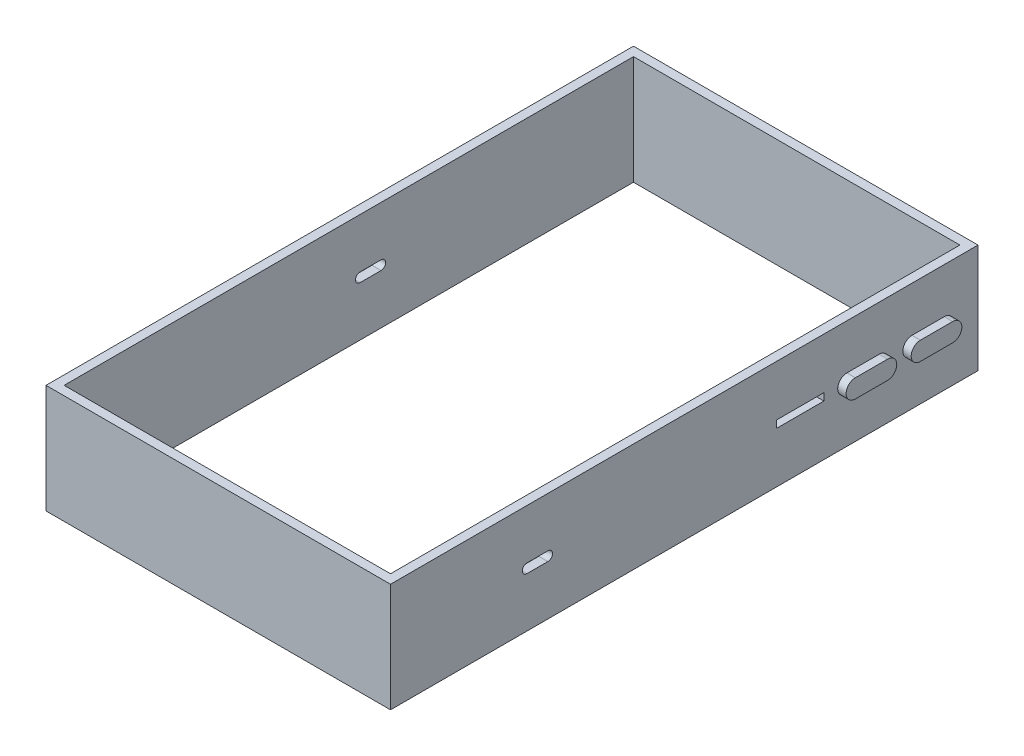
ISO-10303-21;
HEADER;
FILE_DESCRIPTION(('STEP AP214'),'2;1');
FILE_NAME('part.step','',(''),(''),'','','');
FILE_SCHEMA(('AUTOMOTIVE_DESIGN { 1 0 10303 214 1 1 1 1 }'));
ENDSEC;
DATA;
#1=APPLICATION_CONTEXT('core data for automotive mechanical design processes');
#2=APPLICATION_PROTOCOL_DEFINITION('international standard','automotive_design',2000,#1);
#3=PRODUCT_CONTEXT('',#1,'mechanical');
#4=PRODUCT('Part','Part','',(#3));
#5=PRODUCT_RELATED_PRODUCT_CATEGORY('part','',(#4));
#6=PRODUCT_DEFINITION_FORMATION('','',#4);
#7=PRODUCT_DEFINITION_CONTEXT('part definition',#1,'design');
#8=PRODUCT_DEFINITION('design','',#6,#7);
#9=PRODUCT_DEFINITION_SHAPE('','',#8);
#10=(LENGTH_UNIT() NAMED_UNIT(*) SI_UNIT(.MILLI.,.METRE.));
#11=(NAMED_UNIT(*) PLANE_ANGLE_UNIT() SI_UNIT($,.RADIAN.));
#12=(NAMED_UNIT(*) SI_UNIT($,.STERADIAN.) SOLID_ANGLE_UNIT());
#13=UNCERTAINTY_MEASURE_WITH_UNIT(LENGTH_MEASURE(1.E-05),#10,'distance_accuracy_value','');
#14=(GEOMETRIC_REPRESENTATION_CONTEXT(3) GLOBAL_UNCERTAINTY_ASSIGNED_CONTEXT((#13)) GLOBAL_UNIT_ASSIGNED_CONTEXT((#10,
#11,#12)) REPRESENTATION_CONTEXT('',''));
#15=CARTESIAN_POINT('',(0.,0.,0.));
#16=DIRECTION('',(0.,0.,1.));
#17=DIRECTION('',(1.,0.,0.));
#18=AXIS2_PLACEMENT_3D('',#15,#16,#17);
#19=CARTESIAN_POINT('',(-47.499999996,30.,81.000000052));
#20=DIRECTION('',(1.,0.,0.));
#21=DIRECTION('',(0.,0.,-1.));
#22=AXIS2_PLACEMENT_3D('',#19,#20,#21);
#23=PLANE('',#22);
#24=DIRECTION('',(0.,0.,1.));
#25=VECTOR('',#24,1.);
#26=CARTESIAN_POINT('',(-47.499999996,0.,81.000000052));
#27=LINE('',#26,#25);
#28=CARTESIAN_POINT('',(-47.499999996,0.,-81.000000052));
#29=VERTEX_POINT('',#28);
#30=CARTESIAN_POINT('',(-47.499999996,0.,81.000000052));
#31=VERTEX_POINT('',#30);
#32=EDGE_CURVE('E525',#29,#31,#27,.T.);
#33=ORIENTED_EDGE('',*,*,#32,.T.);
#34=DIRECTION('',(0.,-1.,0.));
#35=VECTOR('',#34,1.);
#36=CARTESIAN_POINT('',(-47.499999996,30.,81.000000052));
#37=LINE('',#36,#35);
#38=CARTESIAN_POINT('',(-47.499999996,30.,81.000000052));
#39=VERTEX_POINT('',#38);
#40=EDGE_CURVE('E572',#39,#31,#37,.T.);
#41=ORIENTED_EDGE('',*,*,#40,.F.);
#42=DIRECTION('',(0.,0.,1.));
#43=VECTOR('',#42,1.);
#44=CARTESIAN_POINT('',(-47.499999996,30.,81.000000052));
#45=LINE('',#44,#43);
#46=CARTESIAN_POINT('',(-47.499999996,30.,-81.000000052));
#47=VERTEX_POINT('',#46);
#48=EDGE_CURVE('E535',#47,#39,#45,.T.);
#49=ORIENTED_EDGE('',*,*,#48,.F.);
#50=DIRECTION('',(0.,-1.,0.));
#51=VECTOR('',#50,1.);
#52=CARTESIAN_POINT('',(-47.499999996,30.,-81.000000052));
#53=LINE('',#52,#51);
#54=EDGE_CURVE('E549',#47,#29,#53,.T.);
#55=ORIENTED_EDGE('',*,*,#54,.T.);
#56=EDGE_LOOP('',(#33,#41,#49,#55));
#57=FACE_BOUND('',#56,.T.);
#58=DIRECTION('',(0.,0.,1.));
#59=VECTOR('',#58,1.);
#60=CARTESIAN_POINT('',(-47.499999996,13.72,-8.89000009400002));
#61=LINE('',#60,#59);
#62=CARTESIAN_POINT('',(-47.499999996,13.72,-8.89000009400001));
#63=VERTEX_POINT('',#62);
#64=CARTESIAN_POINT('',(-47.499999996,13.72,-3.11000001000002));
#65=VERTEX_POINT('',#64);
#66=EDGE_CURVE('E282',#63,#65,#61,.T.);
#67=ORIENTED_EDGE('',*,*,#66,.F.);
#68=CARTESIAN_POINT('',(-47.499999996,15.,-8.89000009400002));
#69=DIRECTION('',(-1.,0.,0.));
#70=DIRECTION('',(0.,0.,1.));
#71=AXIS2_PLACEMENT_3D('',#68,#69,#70);
#72=CIRCLE('',#71,1.28);
#73=CARTESIAN_POINT('',(-47.499999996,16.28,-8.89000009400002));
#74=VERTEX_POINT('',#73);
#75=EDGE_CURVE('E278',#74,#63,#72,.T.);
#76=ORIENTED_EDGE('',*,*,#75,.F.);
#77=DIRECTION('',(0.,0.,-1.));
#78=VECTOR('',#77,1.);
#79=CARTESIAN_POINT('',(-47.499999996,16.28,-8.89000009400002));
#80=LINE('',#79,#78);
#81=CARTESIAN_POINT('',(-47.499999996,16.28,-3.11000001000002));
#82=VERTEX_POINT('',#81);
#83=EDGE_CURVE('E295',#82,#74,#80,.T.);
#84=ORIENTED_EDGE('',*,*,#83,.F.);
#85=CARTESIAN_POINT('',(-47.499999996,15.,-3.11000001000002));
#86=DIRECTION('',(-1.,0.,0.));
#87=DIRECTION('',(0.,0.,1.));
#88=AXIS2_PLACEMENT_3D('',#85,#86,#87);
#89=CIRCLE('',#88,1.28);
#90=EDGE_CURVE('E291',#65,#82,#89,.T.);
#91=ORIENTED_EDGE('',*,*,#90,.F.);
#92=EDGE_LOOP('',(#67,#76,#84,#91));
#93=FACE_BOUND('',#92,.T.);
#94=CARTESIAN_POINT('',(-47.499999996,12.2576364727922,-59.880000052));
#95=DIRECTION('',(-1.,0.,0.));
#96=DIRECTION('',(0.,0.,1.));
#97=AXIS2_PLACEMENT_3D('',#94,#95,#96);
#98=CIRCLE('',#97,2.54);
#99=CARTESIAN_POINT('',(-47.499999996,9.71763647279217,-59.880000052));
#100=VERTEX_POINT('',#99);
#101=CARTESIAN_POINT('',(-47.499999996,14.7976364727922,-59.880000052));
#102=VERTEX_POINT('',#101);
#103=EDGE_CURVE('E276',#100,#102,#98,.T.);
#104=ORIENTED_EDGE('',*,*,#103,.F.);
#105=DIRECTION('',(0.,0.,1.));
#106=VECTOR('',#105,1.);
#107=CARTESIAN_POINT('',(-47.499999996,9.71763647279217,-59.880000052));
#108=LINE('',#107,#106);
#109=CARTESIAN_POINT('',(-47.499999996,9.71763647279217,-67.500000052));
#110=VERTEX_POINT('',#109);
#111=EDGE_CURVE('E273',#110,#100,#108,.T.);
#112=ORIENTED_EDGE('',*,*,#111,.F.);
#113=CARTESIAN_POINT('',(-47.499999996,12.2576364727922,-67.500000052));
#114=DIRECTION('',(-1.,0.,0.));
#115=DIRECTION('',(0.,0.,1.));
#116=AXIS2_PLACEMENT_3D('',#113,#114,#115);
#117=CIRCLE('',#116,2.54);
#118=CARTESIAN_POINT('',(-47.499999996,14.7976364727922,-67.500000052));
#119=VERTEX_POINT('',#118);
#120=EDGE_CURVE('E65',#119,#110,#117,.T.);
#121=ORIENTED_EDGE('',*,*,#120,.F.);
#122=DIRECTION('',(0.,0.,-1.));
#123=VECTOR('',#122,1.);
#124=CARTESIAN_POINT('',(-47.499999996,14.7976364727922,-59.880000052));
#125=LINE('',#124,#123);
#126=EDGE_CURVE('E60',#102,#119,#125,.T.);
#127=ORIENTED_EDGE('',*,*,#126,.F.);
#128=EDGE_LOOP('',(#104,#112,#121,#127));
#129=FACE_BOUND('',#128,.T.);
#130=ADVANCED_FACE('F45',(#57,#93,#129),#23,.F.);
#131=CARTESIAN_POINT('',(47.499999996,30.,81.000000052));
#132=DIRECTION('',(-1.,0.,0.));
#133=DIRECTION('',(0.,0.,1.));
#134=AXIS2_PLACEMENT_3D('',#131,#132,#133);
#135=PLANE('',#134);
#136=CARTESIAN_POINT('',(47.499999996,15.,-53.744999952));
#137=DIRECTION('',(1.,0.,0.));
#138=DIRECTION('',(0.,0.,-1.));
#139=AXIS2_PLACEMENT_3D('',#136,#137,#138);
#140=CIRCLE('',#139,2.54);
#141=CARTESIAN_POINT('',(47.499999996,12.46,-53.744999952));
#142=VERTEX_POINT('',#141);
#143=CARTESIAN_POINT('',(47.499999996,17.54,-53.744999952));
#144=VERTEX_POINT('',#143);
#145=EDGE_CURVE('E395',#142,#144,#140,.T.);
#146=ORIENTED_EDGE('',*,*,#145,.F.);
#147=DIRECTION('',(0.,0.,-1.));
#148=VECTOR('',#147,1.);
#149=CARTESIAN_POINT('',(47.499999996,12.46,-53.744999952));
#150=LINE('',#149,#148);
#151=CARTESIAN_POINT('',(47.499999996,12.46,-44.854999952));
#152=VERTEX_POINT('',#151);
#153=EDGE_CURVE('E440',#152,#142,#150,.T.);
#154=ORIENTED_EDGE('',*,*,#153,.F.);
#155=CARTESIAN_POINT('',(47.499999996,15.,-44.854999952));
#156=DIRECTION('',(1.,0.,0.));
#157=DIRECTION('',(0.,0.,-1.));
#158=AXIS2_PLACEMENT_3D('',#155,#156,#157);
#159=CIRCLE('',#158,2.54);
#160=CARTESIAN_POINT('',(47.499999996,17.54,-44.854999952));
#161=VERTEX_POINT('',#160);
#162=EDGE_CURVE('E444',#161,#152,#159,.T.);
#163=ORIENTED_EDGE('',*,*,#162,.F.);
#164=DIRECTION('',(0.,0.,1.));
#165=VECTOR('',#164,1.);
#166=CARTESIAN_POINT('',(47.499999996,17.54,-53.744999952));
#167=LINE('',#166,#165);
#168=EDGE_CURVE('E449',#144,#161,#167,.T.);
#169=ORIENTED_EDGE('',*,*,#168,.F.);
#170=EDGE_LOOP('',(#146,#154,#163,#169));
#171=FACE_BOUND('',#170,.T.);
#172=CARTESIAN_POINT('',(47.499999996,15.,37.609999928));
#173=DIRECTION('',(1.,0.,0.));
#174=DIRECTION('',(0.,0.,-1.));
#175=AXIS2_PLACEMENT_3D('',#172,#173,#174);
#176=CIRCLE('',#175,1.27999998);
#177=CARTESIAN_POINT('',(47.499999996,13.72000002,37.609999928));
#178=VERTEX_POINT('',#177);
#179=CARTESIAN_POINT('',(47.499999996,16.27999998,37.609999928));
#180=VERTEX_POINT('',#179);
#181=EDGE_CURVE('E471',#178,#180,#176,.T.);
#182=ORIENTED_EDGE('',*,*,#181,.F.);
#183=DIRECTION('',(0.,0.,-1.));
#184=VECTOR('',#183,1.);
#185=CARTESIAN_POINT('',(47.499999996,13.72000002,37.609999928));
#186=LINE('',#185,#184);
#187=CARTESIAN_POINT('',(47.499999996,13.72000002,43.389999968));
#188=VERTEX_POINT('',#187);
#189=EDGE_CURVE('E374',#188,#178,#186,.T.);
#190=ORIENTED_EDGE('',*,*,#189,.F.);
#191=CARTESIAN_POINT('',(47.499999996,15.,43.389999968));
#192=DIRECTION('',(1.,0.,0.));
#193=DIRECTION('',(0.,0.,-1.));
#194=AXIS2_PLACEMENT_3D('',#191,#192,#193);
#195=CIRCLE('',#194,1.27999998);
#196=CARTESIAN_POINT('',(47.499999996,16.27999998,43.389999968));
#197=VERTEX_POINT('',#196);
#198=EDGE_CURVE('E482',#197,#188,#195,.T.);
#199=ORIENTED_EDGE('',*,*,#198,.F.);
#200=DIRECTION('',(0.,0.,1.));
#201=VECTOR('',#200,1.);
#202=CARTESIAN_POINT('',(47.499999996,16.27999998,37.609999928));
#203=LINE('',#202,#201);
#204=EDGE_CURVE('E485',#180,#197,#203,.T.);
#205=ORIENTED_EDGE('',*,*,#204,.F.);
#206=EDGE_LOOP('',(#182,#190,#199,#205));
#207=FACE_BOUND('',#206,.T.);
#208=DIRECTION('',(0.,0.,-1.));
#209=VECTOR('',#208,1.);
#210=CARTESIAN_POINT('',(47.499999996,0.,81.000000052));
#211=LINE('',#210,#209);
#212=CARTESIAN_POINT('',(47.499999996,0.,81.000000052));
#213=VERTEX_POINT('',#212);
#214=CARTESIAN_POINT('',(47.499999996,0.,-81.000000052));
#215=VERTEX_POINT('',#214);
#216=EDGE_CURVE('E556',#213,#215,#211,.T.);
#217=ORIENTED_EDGE('',*,*,#216,.T.);
#218=DIRECTION('',(0.,-1.,0.));
#219=VECTOR('',#218,1.);
#220=CARTESIAN_POINT('',(47.499999996,30.,-81.000000052));
#221=LINE('',#220,#219);
#222=CARTESIAN_POINT('',(47.499999996,30.,-81.000000052));
#223=VERTEX_POINT('',#222);
#224=EDGE_CURVE('E564',#223,#215,#221,.T.);
#225=ORIENTED_EDGE('',*,*,#224,.F.);
#226=DIRECTION('',(0.,0.,-1.));
#227=VECTOR('',#226,1.);
#228=CARTESIAN_POINT('',(47.499999996,30.,81.000000052));
#229=LINE('',#228,#227);
#230=CARTESIAN_POINT('',(47.499999996,30.,81.000000052));
#231=VERTEX_POINT('',#230);
#232=EDGE_CURVE('E543',#231,#223,#229,.T.);
#233=ORIENTED_EDGE('',*,*,#232,.F.);
#234=DIRECTION('',(0.,-1.,0.));
#235=VECTOR('',#234,1.);
#236=CARTESIAN_POINT('',(47.499999996,30.,81.000000052));
#237=LINE('',#236,#235);
#238=EDGE_CURVE('E568',#231,#213,#237,.T.);
#239=ORIENTED_EDGE('',*,*,#238,.T.);
#240=EDGE_LOOP('',(#217,#225,#233,#239));
#241=FACE_BOUND('',#240,.T.);
#242=DIRECTION('',(0.,-1.,0.));
#243=VECTOR('',#242,1.);
#244=CARTESIAN_POINT('',(47.499999996,14.,-25.500000052));
#245=LINE('',#244,#243);
#246=CARTESIAN_POINT('',(47.499999996,16.,-25.500000052));
#247=VERTEX_POINT('',#246);
#248=CARTESIAN_POINT('',(47.499999996,14.,-25.500000052));
#249=VERTEX_POINT('',#248);
#250=EDGE_CURVE('E427',#247,#249,#245,.T.);
#251=ORIENTED_EDGE('',*,*,#250,.F.);
#252=DIRECTION('',(0.,0.,1.));
#253=VECTOR('',#252,1.);
#254=CARTESIAN_POINT('',(47.499999996,16.,-38.500000052));
#255=LINE('',#254,#253);
#256=CARTESIAN_POINT('',(47.499999996,16.,-38.500000052));
#257=VERTEX_POINT('',#256);
#258=EDGE_CURVE('E467',#257,#247,#255,.T.);
#259=ORIENTED_EDGE('',*,*,#258,.F.);
#260=DIRECTION('',(0.,1.,0.));
#261=VECTOR('',#260,1.);
#262=CARTESIAN_POINT('',(47.499999996,14.,-38.500000052));
#263=LINE('',#262,#261);
#264=CARTESIAN_POINT('',(47.499999996,14.,-38.500000052));
#265=VERTEX_POINT('',#264);
#266=EDGE_CURVE('E470',#265,#257,#263,.T.);
#267=ORIENTED_EDGE('',*,*,#266,.F.);
#268=DIRECTION('',(0.,0.,-1.));
#269=VECTOR('',#268,1.);
#270=CARTESIAN_POINT('',(47.499999996,14.,-38.500000052));
#271=LINE('',#270,#269);
#272=EDGE_CURVE('E474',#249,#265,#271,.T.);
#273=ORIENTED_EDGE('',*,*,#272,.F.);
#274=EDGE_LOOP('',(#251,#259,#267,#273));
#275=FACE_BOUND('',#274,.T.);
#276=CARTESIAN_POINT('',(47.499999996,15.,-71.695000052));
#277=DIRECTION('',(1.,0.,0.));
#278=DIRECTION('',(0.,0.,-1.));
#279=AXIS2_PLACEMENT_3D('',#276,#277,#278);
#280=CIRCLE('',#279,2.54);
#281=CARTESIAN_POINT('',(47.499999996,12.46,-71.695000052));
#282=VERTEX_POINT('',#281);
#283=CARTESIAN_POINT('',(47.499999996,17.54,-71.695000052));
#284=VERTEX_POINT('',#283);
#285=EDGE_CURVE('E390',#282,#284,#280,.T.);
#286=ORIENTED_EDGE('',*,*,#285,.F.);
#287=DIRECTION('',(0.,0.,-1.));
#288=VECTOR('',#287,1.);
#289=CARTESIAN_POINT('',(47.499999996,12.46,-71.695000052));
#290=LINE('',#289,#288);
#291=CARTESIAN_POINT('',(47.499999996,12.46,-62.805000052));
#292=VERTEX_POINT('',#291);
#293=EDGE_CURVE('E380',#292,#282,#290,.T.);
#294=ORIENTED_EDGE('',*,*,#293,.F.);
#295=CARTESIAN_POINT('',(47.499999996,15.,-62.805000052));
#296=DIRECTION('',(1.,0.,0.));
#297=DIRECTION('',(0.,0.,-1.));
#298=AXIS2_PLACEMENT_3D('',#295,#296,#297);
#299=CIRCLE('',#298,2.54);
#300=CARTESIAN_POINT('',(47.499999996,17.54,-62.805000052));
#301=VERTEX_POINT('',#300);
#302=EDGE_CURVE('E399',#301,#292,#299,.T.);
#303=ORIENTED_EDGE('',*,*,#302,.F.);
#304=DIRECTION('',(0.,0.,1.));
#305=VECTOR('',#304,1.);
#306=CARTESIAN_POINT('',(47.499999996,17.54,-71.695000052));
#307=LINE('',#306,#305);
#308=EDGE_CURVE('E394',#284,#301,#307,.T.);
#309=ORIENTED_EDGE('',*,*,#308,.F.);
#310=EDGE_LOOP('',(#286,#294,#303,#309));
#311=FACE_BOUND('',#310,.T.);
#312=ADVANCED_FACE('F615',(#171,#207,#241,#275,#311),#135,.F.);
#313=CARTESIAN_POINT('',(47.499999996,30.,81.000000052));
#314=DIRECTION('',(0.,0.,-1.));
#315=DIRECTION('',(-1.,0.,0.));
#316=AXIS2_PLACEMENT_3D('',#313,#314,#315);
#317=PLANE('',#316);
#318=DIRECTION('',(1.,0.,0.));
#319=VECTOR('',#318,1.);
#320=CARTESIAN_POINT('',(47.499999996,0.,81.000000052));
#321=LINE('',#320,#319);
#322=EDGE_CURVE('E553',#31,#213,#321,.T.);
#323=ORIENTED_EDGE('',*,*,#322,.T.);
#324=ORIENTED_EDGE('',*,*,#238,.F.);
#325=DIRECTION('',(1.,0.,0.));
#326=VECTOR('',#325,1.);
#327=CARTESIAN_POINT('',(47.499999996,30.,81.000000052));
#328=LINE('',#327,#326);
#329=EDGE_CURVE('E539',#39,#231,#328,.T.);
#330=ORIENTED_EDGE('',*,*,#329,.F.);
#331=ORIENTED_EDGE('',*,*,#40,.T.);
#332=EDGE_LOOP('',(#323,#324,#330,#331));
#333=FACE_BOUND('',#332,.T.);
#334=ADVANCED_FACE('F620',(#333),#317,.F.);
#335=CARTESIAN_POINT('',(47.499999996,30.,-81.000000052));
#336=DIRECTION('',(0.,0.,1.));
#337=DIRECTION('',(1.,0.,0.));
#338=AXIS2_PLACEMENT_3D('',#335,#336,#337);
#339=PLANE('',#338);
#340=DIRECTION('',(-1.,0.,0.));
#341=VECTOR('',#340,1.);
#342=CARTESIAN_POINT('',(47.499999996,0.,-81.000000052));
#343=LINE('',#342,#341);
#344=EDGE_CURVE('E540',#215,#29,#343,.T.);
#345=ORIENTED_EDGE('',*,*,#344,.T.);
#346=ORIENTED_EDGE('',*,*,#54,.F.);
#347=DIRECTION('',(-1.,0.,0.));
#348=VECTOR('',#347,1.);
#349=CARTESIAN_POINT('',(47.499999996,30.,-81.000000052));
#350=LINE('',#349,#348);
#351=EDGE_CURVE('E546',#223,#47,#350,.T.);
#352=ORIENTED_EDGE('',*,*,#351,.F.);
#353=ORIENTED_EDGE('',*,*,#224,.T.);
#354=EDGE_LOOP('',(#345,#346,#352,#353));
#355=FACE_BOUND('',#354,.T.);
#356=ADVANCED_FACE('F639',(#355),#339,.F.);
#357=CARTESIAN_POINT('',(0.,30.,0.));
#358=DIRECTION('',(0.,1.,0.));
#359=DIRECTION('',(0.,0.,1.));
#360=AXIS2_PLACEMENT_3D('',#357,#358,#359);
#361=PLANE('',#360);
#362=DIRECTION('',(0.,0.,1.));
#363=VECTOR('',#362,1.);
#364=CARTESIAN_POINT('',(-45.000000043,30.,78.499999972));
#365=LINE('',#364,#363);
#366=CARTESIAN_POINT('',(-45.000000043,30.,-78.499999972));
#367=VERTEX_POINT('',#366);
#368=CARTESIAN_POINT('',(-45.000000043,30.,78.499999972));
#369=VERTEX_POINT('',#368);
#370=EDGE_CURVE('E421',#367,#369,#365,.T.);
#371=ORIENTED_EDGE('',*,*,#370,.F.);
#372=DIRECTION('',(-1.,0.,0.));
#373=VECTOR('',#372,1.);
#374=CARTESIAN_POINT('',(45.000000043,30.,-78.499999972));
#375=LINE('',#374,#373);
#376=CARTESIAN_POINT('',(45.000000043,30.,-78.499999972));
#377=VERTEX_POINT('',#376);
#378=EDGE_CURVE('E496',#377,#367,#375,.T.);
#379=ORIENTED_EDGE('',*,*,#378,.F.);
#380=DIRECTION('',(0.,0.,-1.));
#381=VECTOR('',#380,1.);
#382=CARTESIAN_POINT('',(45.000000043,30.,78.499999972));
#383=LINE('',#382,#381);
#384=CARTESIAN_POINT('',(45.000000043,30.,78.499999972));
#385=VERTEX_POINT('',#384);
#386=EDGE_CURVE('E515',#385,#377,#383,.T.);
#387=ORIENTED_EDGE('',*,*,#386,.F.);
#388=DIRECTION('',(1.,0.,0.));
#389=VECTOR('',#388,1.);
#390=CARTESIAN_POINT('',(45.000000043,30.,78.499999972));
#391=LINE('',#390,#389);
#392=EDGE_CURVE('E511',#369,#385,#391,.T.);
#393=ORIENTED_EDGE('',*,*,#392,.F.);
#394=EDGE_LOOP('',(#371,#379,#387,#393));
#395=FACE_BOUND('',#394,.T.);
#396=ORIENTED_EDGE('',*,*,#48,.T.);
#397=ORIENTED_EDGE('',*,*,#329,.T.);
#398=ORIENTED_EDGE('',*,*,#232,.T.);
#399=ORIENTED_EDGE('',*,*,#351,.T.);
#400=EDGE_LOOP('',(#396,#397,#398,#399));
#401=FACE_BOUND('',#400,.T.);
#402=ADVANCED_FACE('F635',(#395,#401),#361,.T.);
#403=CARTESIAN_POINT('',(0.,0.,0.));
#404=DIRECTION('',(0.,1.,0.));
#405=DIRECTION('',(0.,0.,1.));
#406=AXIS2_PLACEMENT_3D('',#403,#404,#405);
#407=PLANE('',#406);
#408=DIRECTION('',(-1.,0.,0.));
#409=VECTOR('',#408,1.);
#410=CARTESIAN_POINT('',(45.000000043,0.,-78.499999972));
#411=LINE('',#410,#409);
#412=CARTESIAN_POINT('',(45.000000043,0.,-78.499999972));
#413=VERTEX_POINT('',#412);
#414=CARTESIAN_POINT('',(-45.000000043,0.,-78.499999972));
#415=VERTEX_POINT('',#414);
#416=EDGE_CURVE('E504',#413,#415,#411,.T.);
#417=ORIENTED_EDGE('',*,*,#416,.T.);
#418=DIRECTION('',(0.,0.,1.));
#419=VECTOR('',#418,1.);
#420=CARTESIAN_POINT('',(-45.000000043,0.,78.499999972));
#421=LINE('',#420,#419);
#422=CARTESIAN_POINT('',(-45.000000043,0.,78.499999972));
#423=VERTEX_POINT('',#422);
#424=EDGE_CURVE('E491',#415,#423,#421,.T.);
#425=ORIENTED_EDGE('',*,*,#424,.T.);
#426=DIRECTION('',(1.,0.,0.));
#427=VECTOR('',#426,1.);
#428=CARTESIAN_POINT('',(45.000000043,0.,78.499999972));
#429=LINE('',#428,#427);
#430=CARTESIAN_POINT('',(45.000000043,0.,78.499999972));
#431=VERTEX_POINT('',#430);
#432=EDGE_CURVE('E495',#423,#431,#429,.T.);
#433=ORIENTED_EDGE('',*,*,#432,.T.);
#434=DIRECTION('',(0.,0.,-1.));
#435=VECTOR('',#434,1.);
#436=CARTESIAN_POINT('',(45.000000043,0.,78.499999972));
#437=LINE('',#436,#435);
#438=EDGE_CURVE('E500',#431,#413,#437,.T.);
#439=ORIENTED_EDGE('',*,*,#438,.T.);
#440=EDGE_LOOP('',(#417,#425,#433,#439));
#441=FACE_BOUND('',#440,.T.);
#442=ORIENTED_EDGE('',*,*,#32,.F.);
#443=ORIENTED_EDGE('',*,*,#344,.F.);
#444=ORIENTED_EDGE('',*,*,#216,.F.);
#445=ORIENTED_EDGE('',*,*,#322,.F.);
#446=EDGE_LOOP('',(#442,#443,#444,#445));
#447=FACE_BOUND('',#446,.T.);
#448=ADVANCED_FACE('F629',(#441,#447),#407,.F.);
#449=CARTESIAN_POINT('',(-45.000000043,0.,78.499999972));
#450=DIRECTION('',(-1.,0.,0.));
#451=DIRECTION('',(0.,0.,1.));
#452=AXIS2_PLACEMENT_3D('',#449,#450,#451);
#453=PLANE('',#452);
#454=DIRECTION('',(0.,0.,-1.));
#455=VECTOR('',#454,1.);
#456=CARTESIAN_POINT('',(-45.000000043,16.28,78.499999972));
#457=LINE('',#456,#455);
#458=CARTESIAN_POINT('',(-45.000000043,16.28,-3.11000001000002));
#459=VERTEX_POINT('',#458);
#460=CARTESIAN_POINT('',(-45.000000043,16.28,-8.89000009400002));
#461=VERTEX_POINT('',#460);
#462=EDGE_CURVE('E53',#459,#461,#457,.T.);
#463=ORIENTED_EDGE('',*,*,#462,.T.);
#464=CARTESIAN_POINT('',(-45.000000043,15.,-8.89000009400002));
#465=DIRECTION('',(-1.,0.,0.));
#466=DIRECTION('',(0.,0.,1.));
#467=AXIS2_PLACEMENT_3D('',#464,#465,#466);
#468=CIRCLE('',#467,1.28);
#469=CARTESIAN_POINT('',(-45.000000043,13.72,-8.89000009400002));
#470=VERTEX_POINT('',#469);
#471=EDGE_CURVE('E11',#461,#470,#468,.T.);
#472=ORIENTED_EDGE('',*,*,#471,.T.);
#473=DIRECTION('',(0.,0.,1.));
#474=VECTOR('',#473,1.);
#475=CARTESIAN_POINT('',(-45.000000043,13.72,78.499999972));
#476=LINE('',#475,#474);
#477=CARTESIAN_POINT('',(-45.000000043,13.72,-3.11000001000003));
#478=VERTEX_POINT('',#477);
#479=EDGE_CURVE('E576',#470,#478,#476,.T.);
#480=ORIENTED_EDGE('',*,*,#479,.T.);
#481=CARTESIAN_POINT('',(-45.000000043,15.,-3.11000001000002));
#482=DIRECTION('',(-1.,0.,0.));
#483=DIRECTION('',(0.,0.,1.));
#484=AXIS2_PLACEMENT_3D('',#481,#482,#483);
#485=CIRCLE('',#484,1.28);
#486=EDGE_CURVE('E580',#478,#459,#485,.T.);
#487=ORIENTED_EDGE('',*,*,#486,.T.);
#488=EDGE_LOOP('',(#463,#472,#480,#487));
#489=FACE_BOUND('',#488,.T.);
#490=ORIENTED_EDGE('',*,*,#370,.T.);
#491=DIRECTION('',(0.,1.,0.));
#492=VECTOR('',#491,1.);
#493=CARTESIAN_POINT('',(-45.000000043,0.,78.499999972));
#494=LINE('',#493,#492);
#495=EDGE_CURVE('E508',#423,#369,#494,.T.);
#496=ORIENTED_EDGE('',*,*,#495,.F.);
#497=ORIENTED_EDGE('',*,*,#424,.F.);
#498=DIRECTION('',(0.,1.,0.));
#499=VECTOR('',#498,1.);
#500=CARTESIAN_POINT('',(-45.000000043,0.,-78.499999972));
#501=LINE('',#500,#499);
#502=EDGE_CURVE('E522',#415,#367,#501,.T.);
#503=ORIENTED_EDGE('',*,*,#502,.T.);
#504=EDGE_LOOP('',(#490,#496,#497,#503));
#505=FACE_BOUND('',#504,.T.);
#506=ADVANCED_FACE('F586',(#489,#505),#453,.F.);
#507=CARTESIAN_POINT('',(45.000000043,0.,-78.499999972));
#508=DIRECTION('',(0.,0.,-1.));
#509=DIRECTION('',(-1.,0.,0.));
#510=AXIS2_PLACEMENT_3D('',#507,#508,#509);
#511=PLANE('',#510);
#512=ORIENTED_EDGE('',*,*,#378,.T.);
#513=ORIENTED_EDGE('',*,*,#502,.F.);
#514=ORIENTED_EDGE('',*,*,#416,.F.);
#515=DIRECTION('',(0.,1.,0.));
#516=VECTOR('',#515,1.);
#517=CARTESIAN_POINT('',(45.000000043,0.,-78.499999972));
#518=LINE('',#517,#516);
#519=EDGE_CURVE('E526',#413,#377,#518,.T.);
#520=ORIENTED_EDGE('',*,*,#519,.T.);
#521=EDGE_LOOP('',(#512,#513,#514,#520));
#522=FACE_BOUND('',#521,.T.);
#523=ADVANCED_FACE('F694',(#522),#511,.F.);
#524=CARTESIAN_POINT('',(45.000000043,0.,78.499999972));
#525=DIRECTION('',(1.,0.,0.));
#526=DIRECTION('',(0.,0.,-1.));
#527=AXIS2_PLACEMENT_3D('',#524,#525,#526);
#528=PLANE('',#527);
#529=CARTESIAN_POINT('',(45.000000043,15.,37.609999928));
#530=DIRECTION('',(1.,0.,0.));
#531=DIRECTION('',(0.,0.,-1.));
#532=AXIS2_PLACEMENT_3D('',#529,#530,#531);
#533=CIRCLE('',#532,1.27999997999999);
#534=CARTESIAN_POINT('',(45.000000043,13.72000002,37.609999928));
#535=VERTEX_POINT('',#534);
#536=CARTESIAN_POINT('',(45.000000043,16.27999998,37.609999928));
#537=VERTEX_POINT('',#536);
#538=EDGE_CURVE('E335',#535,#537,#533,.T.);
#539=ORIENTED_EDGE('',*,*,#538,.T.);
#540=DIRECTION('',(0.,0.,1.));
#541=VECTOR('',#540,1.);
#542=CARTESIAN_POINT('',(45.000000043,16.27999998,78.499999972));
#543=LINE('',#542,#541);
#544=CARTESIAN_POINT('',(45.000000043,16.27999998,43.389999968));
#545=VERTEX_POINT('',#544);
#546=EDGE_CURVE('E339',#537,#545,#543,.T.);
#547=ORIENTED_EDGE('',*,*,#546,.T.);
#548=CARTESIAN_POINT('',(45.000000043,15.,43.389999968));
#549=DIRECTION('',(1.,0.,0.));
#550=DIRECTION('',(0.,0.,-1.));
#551=AXIS2_PLACEMENT_3D('',#548,#549,#550);
#552=CIRCLE('',#551,1.27999997999999);
#553=CARTESIAN_POINT('',(45.000000043,13.72000002,43.389999968));
#554=VERTEX_POINT('',#553);
#555=EDGE_CURVE('E316',#545,#554,#552,.T.);
#556=ORIENTED_EDGE('',*,*,#555,.T.);
#557=DIRECTION('',(0.,0.,-1.));
#558=VECTOR('',#557,1.);
#559=CARTESIAN_POINT('',(45.000000043,13.72000002,78.499999972));
#560=LINE('',#559,#558);
#561=EDGE_CURVE('E331',#554,#535,#560,.T.);
#562=ORIENTED_EDGE('',*,*,#561,.T.);
#563=EDGE_LOOP('',(#539,#547,#556,#562));
#564=FACE_BOUND('',#563,.T.);
#565=DIRECTION('',(0.,0.,1.));
#566=VECTOR('',#565,1.);
#567=CARTESIAN_POINT('',(45.000000043,16.,78.499999972));
#568=LINE('',#567,#566);
#569=CARTESIAN_POINT('',(45.000000043,16.,-38.500000052));
#570=VERTEX_POINT('',#569);
#571=CARTESIAN_POINT('',(45.000000043,16.,-25.500000052));
#572=VERTEX_POINT('',#571);
#573=EDGE_CURVE('E366',#570,#572,#568,.T.);
#574=ORIENTED_EDGE('',*,*,#573,.T.);
#575=DIRECTION('',(0.,-1.,0.));
#576=VECTOR('',#575,1.);
#577=CARTESIAN_POINT('',(45.000000043,-3.60822483086442E-13,-25.500000052));
#578=LINE('',#577,#576);
#579=CARTESIAN_POINT('',(45.000000043,14.,-25.500000052));
#580=VERTEX_POINT('',#579);
#581=EDGE_CURVE('E370',#572,#580,#578,.T.);
#582=ORIENTED_EDGE('',*,*,#581,.T.);
#583=DIRECTION('',(0.,0.,-1.));
#584=VECTOR('',#583,1.);
#585=CARTESIAN_POINT('',(45.000000043,14.,78.499999972));
#586=LINE('',#585,#584);
#587=CARTESIAN_POINT('',(45.000000043,14.,-38.500000052));
#588=VERTEX_POINT('',#587);
#589=EDGE_CURVE('E348',#580,#588,#586,.T.);
#590=ORIENTED_EDGE('',*,*,#589,.T.);
#591=DIRECTION('',(0.,1.,0.));
#592=VECTOR('',#591,1.);
#593=CARTESIAN_POINT('',(45.000000043,4.05925293461839E-13,-38.500000052));
#594=LINE('',#593,#592);
#595=EDGE_CURVE('E362',#588,#570,#594,.T.);
#596=ORIENTED_EDGE('',*,*,#595,.T.);
#597=EDGE_LOOP('',(#574,#582,#590,#596));
#598=FACE_BOUND('',#597,.T.);
#599=ORIENTED_EDGE('',*,*,#386,.T.);
#600=ORIENTED_EDGE('',*,*,#519,.F.);
#601=ORIENTED_EDGE('',*,*,#438,.F.);
#602=DIRECTION('',(0.,1.,0.));
#603=VECTOR('',#602,1.);
#604=CARTESIAN_POINT('',(45.000000043,0.,78.499999972));
#605=LINE('',#604,#603);
#606=EDGE_CURVE('E529',#431,#385,#605,.T.);
#607=ORIENTED_EDGE('',*,*,#606,.T.);
#608=EDGE_LOOP('',(#599,#600,#601,#607));
#609=FACE_BOUND('',#608,.T.);
#610=ADVANCED_FACE('F697',(#564,#598,#609),#528,.F.);
#611=CARTESIAN_POINT('',(45.000000043,0.,78.499999972));
#612=DIRECTION('',(0.,0.,1.));
#613=DIRECTION('',(1.,0.,0.));
#614=AXIS2_PLACEMENT_3D('',#611,#612,#613);
#615=PLANE('',#614);
#616=ORIENTED_EDGE('',*,*,#392,.T.);
#617=ORIENTED_EDGE('',*,*,#606,.F.);
#618=ORIENTED_EDGE('',*,*,#432,.F.);
#619=ORIENTED_EDGE('',*,*,#495,.T.);
#620=EDGE_LOOP('',(#616,#617,#618,#619));
#621=FACE_BOUND('',#620,.T.);
#622=ADVANCED_FACE('F678',(#621),#615,.F.);
#623=CARTESIAN_POINT('',(49.813999996,15.,-53.744999952));
#624=DIRECTION('',(-1.,0.,0.));
#625=DIRECTION('',(0.,0.,1.));
#626=AXIS2_PLACEMENT_3D('',#623,#624,#625);
#627=CYLINDRICAL_SURFACE('',#626,2.54);
#628=ORIENTED_EDGE('',*,*,#145,.T.);
#629=DIRECTION('',(-1.,0.,0.));
#630=VECTOR('',#629,1.);
#631=CARTESIAN_POINT('',(49.813999996,17.54,-53.744999952));
#632=LINE('',#631,#630);
#633=CARTESIAN_POINT('',(49.813999996,17.54,-53.744999952));
#634=VERTEX_POINT('',#633);
#635=EDGE_CURVE('E422',#634,#144,#632,.T.);
#636=ORIENTED_EDGE('',*,*,#635,.F.);
#637=CARTESIAN_POINT('',(49.813999996,15.,-53.744999952));
#638=DIRECTION('',(1.,0.,0.));
#639=DIRECTION('',(0.,0.,-1.));
#640=AXIS2_PLACEMENT_3D('',#637,#638,#639);
#641=CIRCLE('',#640,2.54);
#642=CARTESIAN_POINT('',(49.813999996,12.46,-53.744999952));
#643=VERTEX_POINT('',#642);
#644=EDGE_CURVE('E445',#643,#634,#641,.T.);
#645=ORIENTED_EDGE('',*,*,#644,.F.);
#646=DIRECTION('',(-1.,0.,0.));
#647=VECTOR('',#646,1.);
#648=CARTESIAN_POINT('',(49.813999996,12.46,-53.744999952));
#649=LINE('',#648,#647);
#650=EDGE_CURVE('E435',#643,#142,#649,.T.);
#651=ORIENTED_EDGE('',*,*,#650,.T.);
#652=EDGE_LOOP('',(#628,#636,#645,#651));
#653=FACE_BOUND('',#652,.T.);
#654=ADVANCED_FACE('F674',(#653),#627,.T.);
#655=CARTESIAN_POINT('',(49.813999996,17.54,-53.744999952));
#656=DIRECTION('',(0.,-1.,0.));
#657=DIRECTION('',(0.,0.,-1.));
#658=AXIS2_PLACEMENT_3D('',#655,#656,#657);
#659=PLANE('',#658);
#660=ORIENTED_EDGE('',*,*,#168,.T.);
#661=DIRECTION('',(-1.,0.,0.));
#662=VECTOR('',#661,1.);
#663=CARTESIAN_POINT('',(49.813999996,17.54,-44.854999952));
#664=LINE('',#663,#662);
#665=CARTESIAN_POINT('',(49.813999996,17.54,-44.854999952));
#666=VERTEX_POINT('',#665);
#667=EDGE_CURVE('E426',#666,#161,#664,.T.);
#668=ORIENTED_EDGE('',*,*,#667,.F.);
#669=DIRECTION('',(0.,0.,1.));
#670=VECTOR('',#669,1.);
#671=CARTESIAN_POINT('',(49.813999996,17.54,-53.744999952));
#672=LINE('',#671,#670);
#673=EDGE_CURVE('E461',#634,#666,#672,.T.);
#674=ORIENTED_EDGE('',*,*,#673,.F.);
#675=ORIENTED_EDGE('',*,*,#635,.T.);
#676=EDGE_LOOP('',(#660,#668,#674,#675));
#677=FACE_BOUND('',#676,.T.);
#678=ADVANCED_FACE('F677',(#677),#659,.F.);
#679=CARTESIAN_POINT('',(49.813999996,15.,-44.854999952));
#680=DIRECTION('',(-1.,0.,0.));
#681=DIRECTION('',(0.,0.,1.));
#682=AXIS2_PLACEMENT_3D('',#679,#680,#681);
#683=CYLINDRICAL_SURFACE('',#682,2.54);
#684=ORIENTED_EDGE('',*,*,#162,.T.);
#685=DIRECTION('',(-1.,0.,0.));
#686=VECTOR('',#685,1.);
#687=CARTESIAN_POINT('',(49.813999996,12.46,-44.854999952));
#688=LINE('',#687,#686);
#689=CARTESIAN_POINT('',(49.813999996,12.46,-44.854999952));
#690=VERTEX_POINT('',#689);
#691=EDGE_CURVE('E431',#690,#152,#688,.T.);
#692=ORIENTED_EDGE('',*,*,#691,.F.);
#693=CARTESIAN_POINT('',(49.813999996,15.,-44.854999952));
#694=DIRECTION('',(1.,0.,0.));
#695=DIRECTION('',(0.,0.,-1.));
#696=AXIS2_PLACEMENT_3D('',#693,#694,#695);
#697=CIRCLE('',#696,2.54);
#698=EDGE_CURVE('E458',#666,#690,#697,.T.);
#699=ORIENTED_EDGE('',*,*,#698,.F.);
#700=ORIENTED_EDGE('',*,*,#667,.T.);
#701=EDGE_LOOP('',(#684,#692,#699,#700));
#702=FACE_BOUND('',#701,.T.);
#703=ADVANCED_FACE('F682',(#702),#683,.T.);
#704=CARTESIAN_POINT('',(49.813999996,12.46,-53.744999952));
#705=DIRECTION('',(0.,1.,0.));
#706=DIRECTION('',(0.,0.,1.));
#707=AXIS2_PLACEMENT_3D('',#704,#705,#706);
#708=PLANE('',#707);
#709=ORIENTED_EDGE('',*,*,#153,.T.);
#710=ORIENTED_EDGE('',*,*,#650,.F.);
#711=DIRECTION('',(0.,0.,-1.));
#712=VECTOR('',#711,1.);
#713=CARTESIAN_POINT('',(49.813999996,12.46,-53.744999952));
#714=LINE('',#713,#712);
#715=EDGE_CURVE('E439',#690,#643,#714,.T.);
#716=ORIENTED_EDGE('',*,*,#715,.F.);
#717=ORIENTED_EDGE('',*,*,#691,.T.);
#718=EDGE_LOOP('',(#709,#710,#716,#717));
#719=FACE_BOUND('',#718,.T.);
#720=ADVANCED_FACE('F686',(#719),#708,.F.);
#721=CARTESIAN_POINT('',(49.813999996,15.,-53.744999952));
#722=DIRECTION('',(1.,0.,0.));
#723=DIRECTION('',(0.,0.,-1.));
#724=AXIS2_PLACEMENT_3D('',#721,#722,#723);
#725=PLANE('',#724);
#726=ORIENTED_EDGE('',*,*,#644,.T.);
#727=ORIENTED_EDGE('',*,*,#673,.T.);
#728=ORIENTED_EDGE('',*,*,#698,.T.);
#729=ORIENTED_EDGE('',*,*,#715,.T.);
#730=EDGE_LOOP('',(#726,#727,#728,#729));
#731=FACE_BOUND('',#730,.T.);
#732=ADVANCED_FACE('F670',(#731),#725,.T.);
#733=CARTESIAN_POINT('',(49.813999996,15.,-71.695000052));
#734=DIRECTION('',(-1.,0.,0.));
#735=DIRECTION('',(0.,0.,1.));
#736=AXIS2_PLACEMENT_3D('',#733,#734,#735);
#737=CYLINDRICAL_SURFACE('',#736,2.54);
#738=ORIENTED_EDGE('',*,*,#285,.T.);
#739=DIRECTION('',(-1.,0.,0.));
#740=VECTOR('',#739,1.);
#741=CARTESIAN_POINT('',(49.813999996,17.54,-71.695000052));
#742=LINE('',#741,#740);
#743=CARTESIAN_POINT('',(49.813999996,17.54,-71.695000052));
#744=VERTEX_POINT('',#743);
#745=EDGE_CURVE('E417',#744,#284,#742,.T.);
#746=ORIENTED_EDGE('',*,*,#745,.F.);
#747=CARTESIAN_POINT('',(49.813999996,15.,-71.695000052));
#748=DIRECTION('',(1.,0.,0.));
#749=DIRECTION('',(0.,0.,-1.));
#750=AXIS2_PLACEMENT_3D('',#747,#748,#749);
#751=CIRCLE('',#750,2.54);
#752=CARTESIAN_POINT('',(49.813999996,12.46,-71.695000052));
#753=VERTEX_POINT('',#752);
#754=EDGE_CURVE('E375',#753,#744,#751,.T.);
#755=ORIENTED_EDGE('',*,*,#754,.F.);
#756=DIRECTION('',(-1.,0.,0.));
#757=VECTOR('',#756,1.);
#758=CARTESIAN_POINT('',(49.813999996,12.46,-71.695000052));
#759=LINE('',#758,#757);
#760=EDGE_CURVE('E389',#753,#282,#759,.T.);
#761=ORIENTED_EDGE('',*,*,#760,.T.);
#762=EDGE_LOOP('',(#738,#746,#755,#761));
#763=FACE_BOUND('',#762,.T.);
#764=ADVANCED_FACE('F654',(#763),#737,.T.);
#765=CARTESIAN_POINT('',(49.813999996,17.54,-71.695000052));
#766=DIRECTION('',(0.,-1.,0.));
#767=DIRECTION('',(0.,0.,-1.));
#768=AXIS2_PLACEMENT_3D('',#765,#766,#767);
#769=PLANE('',#768);
#770=ORIENTED_EDGE('',*,*,#308,.T.);
#771=DIRECTION('',(-1.,0.,0.));
#772=VECTOR('',#771,1.);
#773=CARTESIAN_POINT('',(49.813999996,17.54,-62.805000052));
#774=LINE('',#773,#772);
#775=CARTESIAN_POINT('',(49.813999996,17.54,-62.805000052));
#776=VERTEX_POINT('',#775);
#777=EDGE_CURVE('E413',#776,#301,#774,.T.);
#778=ORIENTED_EDGE('',*,*,#777,.F.);
#779=DIRECTION('',(0.,0.,1.));
#780=VECTOR('',#779,1.);
#781=CARTESIAN_POINT('',(49.813999996,17.54,-71.695000052));
#782=LINE('',#781,#780);
#783=EDGE_CURVE('E379',#744,#776,#782,.T.);
#784=ORIENTED_EDGE('',*,*,#783,.F.);
#785=ORIENTED_EDGE('',*,*,#745,.T.);
#786=EDGE_LOOP('',(#770,#778,#784,#785));
#787=FACE_BOUND('',#786,.T.);
#788=ADVANCED_FACE('F662',(#787),#769,.F.);
#789=CARTESIAN_POINT('',(49.813999996,15.,-62.805000052));
#790=DIRECTION('',(-1.,0.,0.));
#791=DIRECTION('',(0.,0.,1.));
#792=AXIS2_PLACEMENT_3D('',#789,#790,#791);
#793=CYLINDRICAL_SURFACE('',#792,2.54);
#794=ORIENTED_EDGE('',*,*,#302,.T.);
#795=DIRECTION('',(-1.,0.,0.));
#796=VECTOR('',#795,1.);
#797=CARTESIAN_POINT('',(49.813999996,12.46,-62.805000052));
#798=LINE('',#797,#796);
#799=CARTESIAN_POINT('',(49.813999996,12.46,-62.805000052));
#800=VERTEX_POINT('',#799);
#801=EDGE_CURVE('E409',#800,#292,#798,.T.);
#802=ORIENTED_EDGE('',*,*,#801,.F.);
#803=CARTESIAN_POINT('',(49.813999996,15.,-62.805000052));
#804=DIRECTION('',(1.,0.,0.));
#805=DIRECTION('',(0.,0.,-1.));
#806=AXIS2_PLACEMENT_3D('',#803,#804,#805);
#807=CIRCLE('',#806,2.54);
#808=EDGE_CURVE('E383',#776,#800,#807,.T.);
#809=ORIENTED_EDGE('',*,*,#808,.F.);
#810=ORIENTED_EDGE('',*,*,#777,.T.);
#811=EDGE_LOOP('',(#794,#802,#809,#810));
#812=FACE_BOUND('',#811,.T.);
#813=ADVANCED_FACE('F660',(#812),#793,.T.);
#814=CARTESIAN_POINT('',(49.813999996,12.46,-71.695000052));
#815=DIRECTION('',(0.,1.,0.));
#816=DIRECTION('',(0.,0.,1.));
#817=AXIS2_PLACEMENT_3D('',#814,#815,#816);
#818=PLANE('',#817);
#819=ORIENTED_EDGE('',*,*,#293,.T.);
#820=ORIENTED_EDGE('',*,*,#760,.F.);
#821=DIRECTION('',(0.,0.,-1.));
#822=VECTOR('',#821,1.);
#823=CARTESIAN_POINT('',(49.813999996,12.46,-71.695000052));
#824=LINE('',#823,#822);
#825=EDGE_CURVE('E386',#800,#753,#824,.T.);
#826=ORIENTED_EDGE('',*,*,#825,.F.);
#827=ORIENTED_EDGE('',*,*,#801,.T.);
#828=EDGE_LOOP('',(#819,#820,#826,#827));
#829=FACE_BOUND('',#828,.T.);
#830=ADVANCED_FACE('F650',(#829),#818,.F.);
#831=CARTESIAN_POINT('',(49.813999996,15.,-71.695000052));
#832=DIRECTION('',(1.,0.,0.));
#833=DIRECTION('',(0.,0.,-1.));
#834=AXIS2_PLACEMENT_3D('',#831,#832,#833);
#835=PLANE('',#834);
#836=ORIENTED_EDGE('',*,*,#754,.T.);
#837=ORIENTED_EDGE('',*,*,#783,.T.);
#838=ORIENTED_EDGE('',*,*,#808,.T.);
#839=ORIENTED_EDGE('',*,*,#825,.T.);
#840=EDGE_LOOP('',(#836,#837,#838,#839));
#841=FACE_BOUND('',#840,.T.);
#842=ADVANCED_FACE('F656',(#841),#835,.T.);
#843=CARTESIAN_POINT('',(43.181999996,14.,-25.500000052));
#844=DIRECTION('',(0.,0.,1.));
#845=DIRECTION('',(0.,-1.,0.));
#846=AXIS2_PLACEMENT_3D('',#843,#844,#845);
#847=PLANE('',#846);
#848=DIRECTION('',(1.,0.,0.));
#849=VECTOR('',#848,1.);
#850=CARTESIAN_POINT('',(43.181999996,14.,-25.500000052));
#851=LINE('',#850,#849);
#852=EDGE_CURVE('E343',#580,#249,#851,.T.);
#853=ORIENTED_EDGE('',*,*,#852,.F.);
#854=ORIENTED_EDGE('',*,*,#581,.F.);
#855=DIRECTION('',(1.,0.,0.));
#856=VECTOR('',#855,1.);
#857=CARTESIAN_POINT('',(43.181999996,16.,-25.500000052));
#858=LINE('',#857,#856);
#859=EDGE_CURVE('E344',#572,#247,#858,.T.);
#860=ORIENTED_EDGE('',*,*,#859,.T.);
#861=ORIENTED_EDGE('',*,*,#250,.T.);
#862=EDGE_LOOP('',(#853,#854,#860,#861));
#863=FACE_BOUND('',#862,.T.);
#864=ADVANCED_FACE('F802',(#863),#847,.F.);
#865=CARTESIAN_POINT('',(43.181999996,16.,-25.500000052));
#866=DIRECTION('',(0.,1.,0.));
#867=DIRECTION('',(0.,0.,1.));
#868=AXIS2_PLACEMENT_3D('',#865,#866,#867);
#869=PLANE('',#868);
#870=ORIENTED_EDGE('',*,*,#859,.F.);
#871=ORIENTED_EDGE('',*,*,#573,.F.);
#872=DIRECTION('',(1.,0.,0.));
#873=VECTOR('',#872,1.);
#874=CARTESIAN_POINT('',(43.181999996,16.,-38.500000052));
#875=LINE('',#874,#873);
#876=EDGE_CURVE('E349',#570,#257,#875,.T.);
#877=ORIENTED_EDGE('',*,*,#876,.T.);
#878=ORIENTED_EDGE('',*,*,#258,.T.);
#879=EDGE_LOOP('',(#870,#871,#877,#878));
#880=FACE_BOUND('',#879,.T.);
#881=ADVANCED_FACE('F811',(#880),#869,.F.);
#882=CARTESIAN_POINT('',(43.181999996,16.,-38.500000052));
#883=DIRECTION('',(0.,0.,-1.));
#884=DIRECTION('',(0.,1.,0.));
#885=AXIS2_PLACEMENT_3D('',#882,#883,#884);
#886=PLANE('',#885);
#887=ORIENTED_EDGE('',*,*,#876,.F.);
#888=ORIENTED_EDGE('',*,*,#595,.F.);
#889=DIRECTION('',(1.,0.,0.));
#890=VECTOR('',#889,1.);
#891=CARTESIAN_POINT('',(43.181999996,14.,-38.500000052));
#892=LINE('',#891,#890);
#893=EDGE_CURVE('E353',#588,#265,#892,.T.);
#894=ORIENTED_EDGE('',*,*,#893,.T.);
#895=ORIENTED_EDGE('',*,*,#266,.T.);
#896=EDGE_LOOP('',(#887,#888,#894,#895));
#897=FACE_BOUND('',#896,.T.);
#898=ADVANCED_FACE('F821',(#897),#886,.F.);
#899=CARTESIAN_POINT('',(43.181999996,14.,-38.500000052));
#900=DIRECTION('',(0.,-1.,0.));
#901=DIRECTION('',(0.,0.,-1.));
#902=AXIS2_PLACEMENT_3D('',#899,#900,#901);
#903=PLANE('',#902);
#904=ORIENTED_EDGE('',*,*,#893,.F.);
#905=ORIENTED_EDGE('',*,*,#589,.F.);
#906=ORIENTED_EDGE('',*,*,#852,.T.);
#907=ORIENTED_EDGE('',*,*,#272,.T.);
#908=EDGE_LOOP('',(#904,#905,#906,#907));
#909=FACE_BOUND('',#908,.T.);
#910=ADVANCED_FACE('F831',(#909),#903,.F.);
#911=CARTESIAN_POINT('',(43.181999996,16.27999998,43.389999968));
#912=DIRECTION('',(0.,1.,0.));
#913=DIRECTION('',(0.,0.,1.));
#914=AXIS2_PLACEMENT_3D('',#911,#912,#913);
#915=PLANE('',#914);
#916=DIRECTION('',(1.,0.,0.));
#917=VECTOR('',#916,1.);
#918=CARTESIAN_POINT('',(43.181999996,16.27999998,43.389999968));
#919=LINE('',#918,#917);
#920=EDGE_CURVE('E313',#545,#197,#919,.T.);
#921=ORIENTED_EDGE('',*,*,#920,.F.);
#922=ORIENTED_EDGE('',*,*,#546,.F.);
#923=DIRECTION('',(1.,0.,0.));
#924=VECTOR('',#923,1.);
#925=CARTESIAN_POINT('',(43.181999996,16.27999998,37.609999928));
#926=LINE('',#925,#924);
#927=EDGE_CURVE('E317',#537,#180,#926,.T.);
#928=ORIENTED_EDGE('',*,*,#927,.T.);
#929=ORIENTED_EDGE('',*,*,#204,.T.);
#930=EDGE_LOOP('',(#921,#922,#928,#929));
#931=FACE_BOUND('',#930,.T.);
#932=ADVANCED_FACE('F841',(#931),#915,.F.);
#933=CARTESIAN_POINT('',(43.181999996,15.,37.609999928));
#934=DIRECTION('',(1.,0.,0.));
#935=DIRECTION('',(0.,0.,-1.));
#936=AXIS2_PLACEMENT_3D('',#933,#934,#935);
#937=CYLINDRICAL_SURFACE('',#936,1.27999997999999);
#938=ORIENTED_EDGE('',*,*,#927,.F.);
#939=ORIENTED_EDGE('',*,*,#538,.F.);
#940=DIRECTION('',(1.,0.,0.));
#941=VECTOR('',#940,1.);
#942=CARTESIAN_POINT('',(43.181999996,13.72000002,37.609999928));
#943=LINE('',#942,#941);
#944=EDGE_CURVE('E321',#535,#178,#943,.T.);
#945=ORIENTED_EDGE('',*,*,#944,.T.);
#946=ORIENTED_EDGE('',*,*,#181,.T.);
#947=EDGE_LOOP('',(#938,#939,#945,#946));
#948=FACE_BOUND('',#947,.T.);
#949=ADVANCED_FACE('F851',(#948),#937,.F.);
#950=CARTESIAN_POINT('',(43.181999996,13.72000002,43.389999968));
#951=DIRECTION('',(0.,-1.,0.));
#952=DIRECTION('',(0.,0.,-1.));
#953=AXIS2_PLACEMENT_3D('',#950,#951,#952);
#954=PLANE('',#953);
#955=ORIENTED_EDGE('',*,*,#944,.F.);
#956=ORIENTED_EDGE('',*,*,#561,.F.);
#957=DIRECTION('',(1.,0.,0.));
#958=VECTOR('',#957,1.);
#959=CARTESIAN_POINT('',(43.181999996,13.72000002,43.389999968));
#960=LINE('',#959,#958);
#961=EDGE_CURVE('E303',#554,#188,#960,.T.);
#962=ORIENTED_EDGE('',*,*,#961,.T.);
#963=ORIENTED_EDGE('',*,*,#189,.T.);
#964=EDGE_LOOP('',(#955,#956,#962,#963));
#965=FACE_BOUND('',#964,.T.);
#966=ADVANCED_FACE('F861',(#965),#954,.F.);
#967=CARTESIAN_POINT('',(43.181999996,15.,43.389999968));
#968=DIRECTION('',(1.,0.,0.));
#969=DIRECTION('',(0.,0.,-1.));
#970=AXIS2_PLACEMENT_3D('',#967,#968,#969);
#971=CYLINDRICAL_SURFACE('',#970,1.27999997999999);
#972=ORIENTED_EDGE('',*,*,#961,.F.);
#973=ORIENTED_EDGE('',*,*,#555,.F.);
#974=ORIENTED_EDGE('',*,*,#920,.T.);
#975=ORIENTED_EDGE('',*,*,#198,.T.);
#976=EDGE_LOOP('',(#972,#973,#974,#975));
#977=FACE_BOUND('',#976,.T.);
#978=ADVANCED_FACE('F874',(#977),#971,.F.);
#979=CARTESIAN_POINT('',(-40.867999996,15.,-8.89000009400002));
#980=DIRECTION('',(-1.,0.,0.));
#981=DIRECTION('',(0.,0.,1.));
#982=AXIS2_PLACEMENT_3D('',#979,#980,#981);
#983=CYLINDRICAL_SURFACE('',#982,1.28);
#984=DIRECTION('',(-1.,0.,0.));
#985=VECTOR('',#984,1.);
#986=CARTESIAN_POINT('',(-40.867999996,16.28,-8.89000009400002));
#987=LINE('',#986,#985);
#988=EDGE_CURVE('E300',#461,#74,#987,.T.);
#989=ORIENTED_EDGE('',*,*,#988,.T.);
#990=ORIENTED_EDGE('',*,*,#75,.T.);
#991=DIRECTION('',(-1.,0.,0.));
#992=VECTOR('',#991,1.);
#993=CARTESIAN_POINT('',(-40.867999996,13.72,-8.89000009400002));
#994=LINE('',#993,#992);
#995=EDGE_CURVE('E299',#470,#63,#994,.T.);
#996=ORIENTED_EDGE('',*,*,#995,.F.);
#997=ORIENTED_EDGE('',*,*,#471,.F.);
#998=EDGE_LOOP('',(#989,#990,#996,#997));
#999=FACE_BOUND('',#998,.T.);
#1000=ADVANCED_FACE('F602',(#999),#983,.F.);
#1001=CARTESIAN_POINT('',(-40.867999996,16.28,-8.89000009400002));
#1002=DIRECTION('',(0.,1.,0.));
#1003=DIRECTION('',(0.,0.,1.));
#1004=AXIS2_PLACEMENT_3D('',#1001,#1002,#1003);
#1005=PLANE('',#1004);
#1006=DIRECTION('',(-1.,0.,0.));
#1007=VECTOR('',#1006,1.);
#1008=CARTESIAN_POINT('',(-40.867999996,16.28,-3.11000001000002));
#1009=LINE('',#1008,#1007);
#1010=EDGE_CURVE('E304',#459,#82,#1009,.T.);
#1011=ORIENTED_EDGE('',*,*,#1010,.T.);
#1012=ORIENTED_EDGE('',*,*,#83,.T.);
#1013=ORIENTED_EDGE('',*,*,#988,.F.);
#1014=ORIENTED_EDGE('',*,*,#462,.F.);
#1015=EDGE_LOOP('',(#1011,#1012,#1013,#1014));
#1016=FACE_BOUND('',#1015,.T.);
#1017=ADVANCED_FACE('F592',(#1016),#1005,.F.);
#1018=CARTESIAN_POINT('',(-40.867999996,15.,-3.11000001000002));
#1019=DIRECTION('',(-1.,0.,0.));
#1020=DIRECTION('',(0.,0.,1.));
#1021=AXIS2_PLACEMENT_3D('',#1018,#1019,#1020);
#1022=CYLINDRICAL_SURFACE('',#1021,1.28);
#1023=DIRECTION('',(-1.,0.,0.));
#1024=VECTOR('',#1023,1.);
#1025=CARTESIAN_POINT('',(-40.867999996,13.72,-3.11000001000002));
#1026=LINE('',#1025,#1024);
#1027=EDGE_CURVE('E307',#478,#65,#1026,.T.);
#1028=ORIENTED_EDGE('',*,*,#1027,.T.);
#1029=ORIENTED_EDGE('',*,*,#90,.T.);
#1030=ORIENTED_EDGE('',*,*,#1010,.F.);
#1031=ORIENTED_EDGE('',*,*,#486,.F.);
#1032=EDGE_LOOP('',(#1028,#1029,#1030,#1031));
#1033=FACE_BOUND('',#1032,.T.);
#1034=ADVANCED_FACE('F594',(#1033),#1022,.F.);
#1035=CARTESIAN_POINT('',(-40.867999996,13.72,-8.89000009400002));
#1036=DIRECTION('',(0.,-1.,0.));
#1037=DIRECTION('',(0.,0.,-1.));
#1038=AXIS2_PLACEMENT_3D('',#1035,#1036,#1037);
#1039=PLANE('',#1038);
#1040=ORIENTED_EDGE('',*,*,#995,.T.);
#1041=ORIENTED_EDGE('',*,*,#66,.T.);
#1042=ORIENTED_EDGE('',*,*,#1027,.F.);
#1043=ORIENTED_EDGE('',*,*,#479,.F.);
#1044=EDGE_LOOP('',(#1040,#1041,#1042,#1043));
#1045=FACE_BOUND('',#1044,.T.);
#1046=ADVANCED_FACE('F604',(#1045),#1039,.F.);
#1047=CARTESIAN_POINT('',(-50.039999996,12.2576364727922,-59.880000052));
#1048=DIRECTION('',(1.,0.,0.));
#1049=DIRECTION('',(0.,0.,-1.));
#1050=AXIS2_PLACEMENT_3D('',#1047,#1048,#1049);
#1051=CYLINDRICAL_SURFACE('',#1050,2.54);
#1052=ORIENTED_EDGE('',*,*,#103,.T.);
#1053=DIRECTION('',(1.,0.,0.));
#1054=VECTOR('',#1053,1.);
#1055=CARTESIAN_POINT('',(-50.039999996,14.7976364727922,-59.880000052));
#1056=LINE('',#1055,#1054);
#1057=CARTESIAN_POINT('',(-50.039999996,14.7976364727922,-59.880000052));
#1058=VERTEX_POINT('',#1057);
#1059=EDGE_CURVE('E255',#1058,#102,#1056,.T.);
#1060=ORIENTED_EDGE('',*,*,#1059,.F.);
#1061=CARTESIAN_POINT('',(-50.039999996,12.2576364727922,-59.880000052));
#1062=DIRECTION('',(-1.,0.,0.));
#1063=DIRECTION('',(0.,0.,1.));
#1064=AXIS2_PLACEMENT_3D('',#1061,#1062,#1063);
#1065=CIRCLE('',#1064,2.54);
#1066=CARTESIAN_POINT('',(-50.039999996,9.71763647279217,-59.880000052));
#1067=VERTEX_POINT('',#1066);
#1068=EDGE_CURVE('E263',#1067,#1058,#1065,.T.);
#1069=ORIENTED_EDGE('',*,*,#1068,.F.);
#1070=DIRECTION('',(1.,0.,0.));
#1071=VECTOR('',#1070,1.);
#1072=CARTESIAN_POINT('',(-50.039999996,9.71763647279217,-59.880000052));
#1073=LINE('',#1072,#1071);
#1074=EDGE_CURVE('E963',#1067,#100,#1073,.T.);
#1075=ORIENTED_EDGE('',*,*,#1074,.T.);
#1076=EDGE_LOOP('',(#1052,#1060,#1069,#1075));
#1077=FACE_BOUND('',#1076,.T.);
#1078=ADVANCED_FACE('F275',(#1077),#1051,.T.);
#1079=CARTESIAN_POINT('',(-50.039999996,14.7976364727922,-59.880000052));
#1080=DIRECTION('',(0.,-1.,0.));
#1081=DIRECTION('',(0.,0.,-1.));
#1082=AXIS2_PLACEMENT_3D('',#1079,#1080,#1081);
#1083=PLANE('',#1082);
#1084=ORIENTED_EDGE('',*,*,#126,.T.);
#1085=DIRECTION('',(1.,0.,0.));
#1086=VECTOR('',#1085,1.);
#1087=CARTESIAN_POINT('',(-50.039999996,14.7976364727922,-67.500000052));
#1088=LINE('',#1087,#1086);
#1089=CARTESIAN_POINT('',(-50.039999996,14.7976364727922,-67.500000052));
#1090=VERTEX_POINT('',#1089);
#1091=EDGE_CURVE('E258',#1090,#119,#1088,.T.);
#1092=ORIENTED_EDGE('',*,*,#1091,.F.);
#1093=DIRECTION('',(0.,0.,-1.));
#1094=VECTOR('',#1093,1.);
#1095=CARTESIAN_POINT('',(-50.039999996,14.7976364727922,-59.880000052));
#1096=LINE('',#1095,#1094);
#1097=EDGE_CURVE('E251',#1058,#1090,#1096,.T.);
#1098=ORIENTED_EDGE('',*,*,#1097,.F.);
#1099=ORIENTED_EDGE('',*,*,#1059,.T.);
#1100=EDGE_LOOP('',(#1084,#1092,#1098,#1099));
#1101=FACE_BOUND('',#1100,.T.);
#1102=ADVANCED_FACE('F253',(#1101),#1083,.F.);
#1103=CARTESIAN_POINT('',(-50.039999996,12.2576364727922,-67.500000052));
#1104=DIRECTION('',(1.,0.,0.));
#1105=DIRECTION('',(0.,0.,-1.));
#1106=AXIS2_PLACEMENT_3D('',#1103,#1104,#1105);
#1107=CYLINDRICAL_SURFACE('',#1106,2.54);
#1108=ORIENTED_EDGE('',*,*,#120,.T.);
#1109=DIRECTION('',(1.,0.,0.));
#1110=VECTOR('',#1109,1.);
#1111=CARTESIAN_POINT('',(-50.039999996,9.71763647279217,-67.500000052));
#1112=LINE('',#1111,#1110);
#1113=CARTESIAN_POINT('',(-50.039999996,9.71763647279217,-67.500000052));
#1114=VERTEX_POINT('',#1113);
#1115=EDGE_CURVE('E284',#1114,#110,#1112,.T.);
#1116=ORIENTED_EDGE('',*,*,#1115,.F.);
#1117=CARTESIAN_POINT('',(-50.039999996,12.2576364727922,-67.500000052));
#1118=DIRECTION('',(-1.,0.,0.));
#1119=DIRECTION('',(0.,0.,1.));
#1120=AXIS2_PLACEMENT_3D('',#1117,#1118,#1119);
#1121=CIRCLE('',#1120,2.54);
#1122=EDGE_CURVE('E262',#1090,#1114,#1121,.T.);
#1123=ORIENTED_EDGE('',*,*,#1122,.F.);
#1124=ORIENTED_EDGE('',*,*,#1091,.T.);
#1125=EDGE_LOOP('',(#1108,#1116,#1123,#1124));
#1126=FACE_BOUND('',#1125,.T.);
#1127=ADVANCED_FACE('F931',(#1126),#1107,.T.);
#1128=CARTESIAN_POINT('',(-50.039999996,9.71763647279217,-59.880000052));
#1129=DIRECTION('',(0.,1.,0.));
#1130=DIRECTION('',(0.,0.,1.));
#1131=AXIS2_PLACEMENT_3D('',#1128,#1129,#1130);
#1132=PLANE('',#1131);
#1133=ORIENTED_EDGE('',*,*,#111,.T.);
#1134=ORIENTED_EDGE('',*,*,#1074,.F.);
#1135=DIRECTION('',(0.,0.,1.));
#1136=VECTOR('',#1135,1.);
#1137=CARTESIAN_POINT('',(-50.039999996,9.71763647279217,-59.880000052));
#1138=LINE('',#1137,#1136);
#1139=EDGE_CURVE('E268',#1114,#1067,#1138,.T.);
#1140=ORIENTED_EDGE('',*,*,#1139,.F.);
#1141=ORIENTED_EDGE('',*,*,#1115,.T.);
#1142=EDGE_LOOP('',(#1133,#1134,#1140,#1141));
#1143=FACE_BOUND('',#1142,.T.);
#1144=ADVANCED_FACE('F940',(#1143),#1132,.F.);
#1145=CARTESIAN_POINT('',(-50.039999996,12.2576364727922,-59.880000052));
#1146=DIRECTION('',(-1.,0.,0.));
#1147=DIRECTION('',(0.,0.,1.));
#1148=AXIS2_PLACEMENT_3D('',#1145,#1146,#1147);
#1149=PLANE('',#1148);
#1150=ORIENTED_EDGE('',*,*,#1068,.T.);
#1151=ORIENTED_EDGE('',*,*,#1097,.T.);
#1152=ORIENTED_EDGE('',*,*,#1122,.T.);
#1153=ORIENTED_EDGE('',*,*,#1139,.T.);
#1154=EDGE_LOOP('',(#1150,#1151,#1152,#1153));
#1155=FACE_BOUND('',#1154,.T.);
#1156=ADVANCED_FACE('F266',(#1155),#1149,.T.);
#1157=CLOSED_SHELL('',(#130,#312,#334,#356,#402,#448,#506,#523,#610,#622,#654,#678,#703,#720,
#732,#764,#788,#813,#830,#842,#864,#881,#898,#910,#932,#949,#966,#978,#1000,#1017,#1034,#1046,
#1078,#1102,#1127,#1144,#1156));
#1158=MANIFOLD_SOLID_BREP('B2',#1157);
#1159=ADVANCED_BREP_SHAPE_REPRESENTATION('',(#18,#1158),#14);
#1160=SHAPE_DEFINITION_REPRESENTATION(#9,#1159);
ENDSEC;
END-ISO-10303-21;
